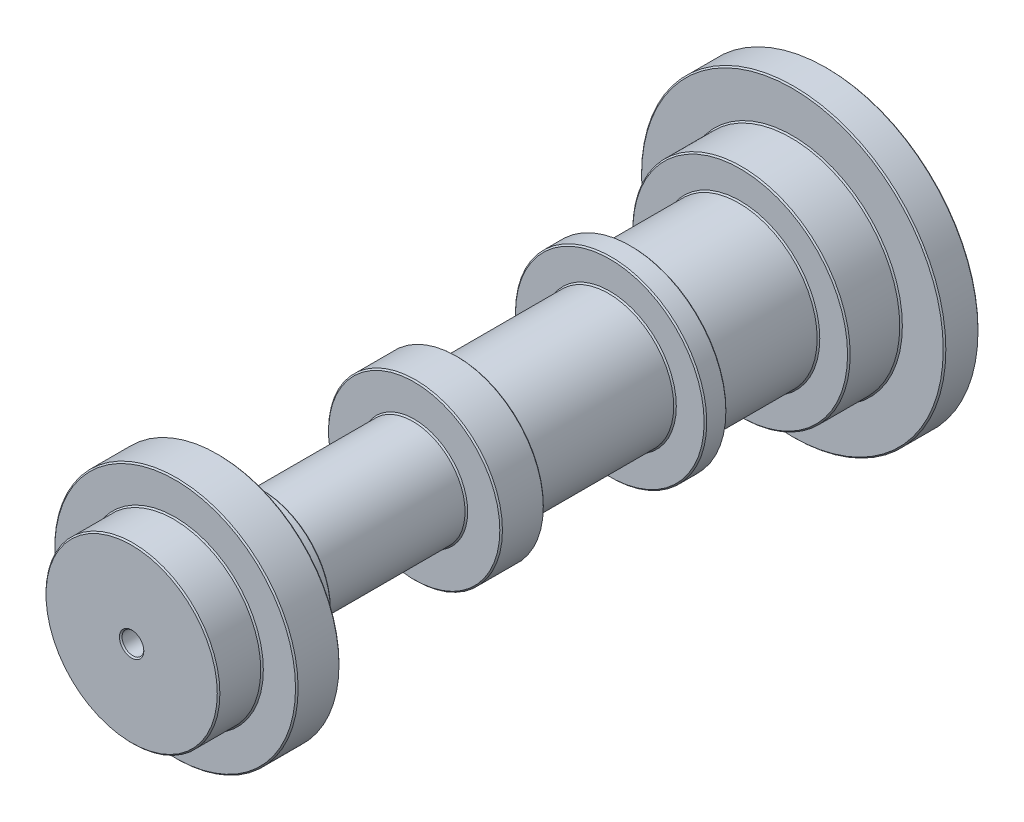
ISO-10303-21;
HEADER;
FILE_DESCRIPTION(('STEP AP214'),'2;1');
FILE_NAME('part.step','',(''),(''),'','','');
FILE_SCHEMA(('AUTOMOTIVE_DESIGN { 1 0 10303 214 1 1 1 1 }'));
ENDSEC;
DATA;
#1=APPLICATION_CONTEXT('core data for automotive mechanical design processes');
#2=APPLICATION_PROTOCOL_DEFINITION('international standard','automotive_design',2000,#1);
#3=PRODUCT_CONTEXT('',#1,'mechanical');
#4=PRODUCT('Part','Part','',(#3));
#5=PRODUCT_RELATED_PRODUCT_CATEGORY('part','',(#4));
#6=PRODUCT_DEFINITION_FORMATION('','',#4);
#7=PRODUCT_DEFINITION_CONTEXT('part definition',#1,'design');
#8=PRODUCT_DEFINITION('design','',#6,#7);
#9=PRODUCT_DEFINITION_SHAPE('','',#8);
#10=(LENGTH_UNIT() NAMED_UNIT(*) SI_UNIT(.MILLI.,.METRE.));
#11=(NAMED_UNIT(*) PLANE_ANGLE_UNIT() SI_UNIT($,.RADIAN.));
#12=(NAMED_UNIT(*) SI_UNIT($,.STERADIAN.) SOLID_ANGLE_UNIT());
#13=UNCERTAINTY_MEASURE_WITH_UNIT(LENGTH_MEASURE(1.E-05),#10,'distance_accuracy_value','');
#14=(GEOMETRIC_REPRESENTATION_CONTEXT(3) GLOBAL_UNCERTAINTY_ASSIGNED_CONTEXT((#13)) GLOBAL_UNIT_ASSIGNED_CONTEXT((#10,
#11,#12)) REPRESENTATION_CONTEXT('',''));
#15=CARTESIAN_POINT('',(0.,0.,0.));
#16=DIRECTION('',(0.,0.,1.));
#17=DIRECTION('',(1.,0.,0.));
#18=AXIS2_PLACEMENT_3D('',#15,#16,#17);
#19=CARTESIAN_POINT('',(0.,0.,85.));
#20=DIRECTION('',(0.,0.,1.));
#21=DIRECTION('',(1.,0.,0.));
#22=AXIS2_PLACEMENT_3D('',#19,#20,#21);
#23=CYLINDRICAL_SURFACE('',#22,20.);
#24=DIRECTION('',(0.,0.,1.));
#25=VECTOR('',#24,1.);
#26=CARTESIAN_POINT('',(20.,0.,85.));
#27=LINE('',#26,#25);
#28=CARTESIAN_POINT('',(20.,0.,85.3));
#29=VERTEX_POINT('',#28);
#30=CARTESIAN_POINT('',(20.,0.,94.7));
#31=VERTEX_POINT('',#30);
#32=EDGE_CURVE('E10',#29,#31,#27,.T.);
#33=ORIENTED_EDGE('',*,*,#32,.F.);
#34=CARTESIAN_POINT('',(0.,0.,85.3));
#35=DIRECTION('',(0.,0.,1.));
#36=DIRECTION('',(1.,0.,0.));
#37=AXIS2_PLACEMENT_3D('',#34,#35,#36);
#38=CIRCLE('',#37,20.);
#39=EDGE_CURVE('E448',#29,#29,#38,.T.);
#40=ORIENTED_EDGE('',*,*,#39,.T.);
#41=ORIENTED_EDGE('',*,*,#32,.T.);
#42=CARTESIAN_POINT('',(0.,0.,94.7));
#43=DIRECTION('',(0.,0.,1.));
#44=DIRECTION('',(1.,0.,0.));
#45=AXIS2_PLACEMENT_3D('',#42,#43,#44);
#46=CIRCLE('',#45,20.);
#47=EDGE_CURVE('E458',#31,#31,#46,.T.);
#48=ORIENTED_EDGE('',*,*,#47,.F.);
#49=EDGE_LOOP('',(#33,#40,#41,#48));
#50=FACE_BOUND('',#49,.T.);
#51=ADVANCED_FACE('F16',(#50),#23,.T.);
#52=CARTESIAN_POINT('',(0.,0.,94.7));
#53=DIRECTION('',(0.,0.,-1.));
#54=DIRECTION('',(1.,0.,0.));
#55=AXIS2_PLACEMENT_3D('',#52,#53,#54);
#56=CONICAL_SURFACE('',#55,20.,0.785398163397);
#57=ORIENTED_EDGE('',*,*,#47,.T.);
#58=DIRECTION('',(0.707106781186548,0.,-0.707106781186548));
#59=VECTOR('',#58,1.);
#60=CARTESIAN_POINT('',(20.,0.,94.7));
#61=LINE('',#60,#59);
#62=CARTESIAN_POINT('',(19.7,0.,95.));
#63=VERTEX_POINT('',#62);
#64=EDGE_CURVE('E20',#63,#31,#61,.T.);
#65=ORIENTED_EDGE('',*,*,#64,.F.);
#66=CARTESIAN_POINT('',(0.,0.,95.));
#67=DIRECTION('',(0.,0.,1.));
#68=DIRECTION('',(1.,0.,0.));
#69=AXIS2_PLACEMENT_3D('',#66,#67,#68);
#70=CIRCLE('',#69,19.7);
#71=EDGE_CURVE('E269',#63,#63,#70,.T.);
#72=ORIENTED_EDGE('',*,*,#71,.F.);
#73=ORIENTED_EDGE('',*,*,#64,.T.);
#74=EDGE_LOOP('',(#57,#65,#72,#73));
#75=FACE_BOUND('',#74,.T.);
#76=ADVANCED_FACE('F467',(#75),#56,.T.);
#77=CARTESIAN_POINT('',(0.,0.,85.3));
#78=DIRECTION('',(0.,0.,1.));
#79=DIRECTION('',(1.,0.,0.));
#80=AXIS2_PLACEMENT_3D('',#77,#78,#79);
#81=CONICAL_SURFACE('',#80,20.,0.785398163397);
#82=DIRECTION('',(0.707106781186548,0.,0.707106781186548));
#83=VECTOR('',#82,1.);
#84=CARTESIAN_POINT('',(20.,0.,85.3));
#85=LINE('',#84,#83);
#86=CARTESIAN_POINT('',(19.7,0.,85.));
#87=VERTEX_POINT('',#86);
#88=EDGE_CURVE('E273',#87,#29,#85,.T.);
#89=ORIENTED_EDGE('',*,*,#88,.F.);
#90=CARTESIAN_POINT('',(0.,0.,85.));
#91=DIRECTION('',(0.,0.,1.));
#92=DIRECTION('',(1.,0.,0.));
#93=AXIS2_PLACEMENT_3D('',#90,#91,#92);
#94=CIRCLE('',#93,19.7);
#95=EDGE_CURVE('E274',#87,#87,#94,.T.);
#96=ORIENTED_EDGE('',*,*,#95,.T.);
#97=ORIENTED_EDGE('',*,*,#88,.T.);
#98=ORIENTED_EDGE('',*,*,#39,.F.);
#99=EDGE_LOOP('',(#89,#96,#97,#98));
#100=FACE_BOUND('',#99,.T.);
#101=ADVANCED_FACE('F473',(#100),#81,.T.);
#102=CARTESIAN_POINT('',(0.,0.,95.));
#103=DIRECTION('',(0.,0.,1.));
#104=DIRECTION('',(1.,0.,0.));
#105=AXIS2_PLACEMENT_3D('',#102,#103,#104);
#106=PLANE('',#105);
#107=ORIENTED_EDGE('',*,*,#71,.T.);
#108=EDGE_LOOP('',(#107));
#109=FACE_BOUND('',#108,.T.);
#110=CARTESIAN_POINT('',(0.,0.,95.));
#111=DIRECTION('',(0.,0.,1.));
#112=DIRECTION('',(1.,0.,0.));
#113=AXIS2_PLACEMENT_3D('',#110,#111,#112);
#114=CIRCLE('',#113,12.3);
#115=CARTESIAN_POINT('',(12.3,0.,95.));
#116=VERTEX_POINT('',#115);
#117=EDGE_CURVE('E414',#116,#116,#114,.T.);
#118=ORIENTED_EDGE('',*,*,#117,.F.);
#119=EDGE_LOOP('',(#118));
#120=FACE_BOUND('',#119,.T.);
#121=ADVANCED_FACE('F469',(#109,#120),#106,.T.);
#122=CARTESIAN_POINT('',(0.,0.,85.));
#123=DIRECTION('',(0.,0.,1.));
#124=DIRECTION('',(1.,0.,0.));
#125=AXIS2_PLACEMENT_3D('',#122,#123,#124);
#126=PLANE('',#125);
#127=ORIENTED_EDGE('',*,*,#95,.F.);
#128=EDGE_LOOP('',(#127));
#129=FACE_BOUND('',#128,.T.);
#130=CARTESIAN_POINT('',(0.,0.,85.));
#131=DIRECTION('',(0.,0.,1.));
#132=DIRECTION('',(1.,0.,0.));
#133=AXIS2_PLACEMENT_3D('',#130,#131,#132);
#134=CIRCLE('',#133,15.3);
#135=CARTESIAN_POINT('',(15.3,0.,85.));
#136=VERTEX_POINT('',#135);
#137=EDGE_CURVE('E332',#136,#136,#134,.T.);
#138=ORIENTED_EDGE('',*,*,#137,.T.);
#139=EDGE_LOOP('',(#138));
#140=FACE_BOUND('',#139,.T.);
#141=ADVANCED_FACE('F472',(#129,#140),#126,.F.);
#142=CARTESIAN_POINT('',(0.,0.,95.3));
#143=DIRECTION('',(0.,0.,-1.));
#144=DIRECTION('',(1.,0.,0.));
#145=AXIS2_PLACEMENT_3D('',#142,#143,#144);
#146=CONICAL_SURFACE('',#145,12.,0.785398163397);
#147=ORIENTED_EDGE('',*,*,#117,.T.);
#148=DIRECTION('',(0.707106781186548,0.,-0.707106781186548));
#149=VECTOR('',#148,1.);
#150=CARTESIAN_POINT('',(12.,0.,95.3));
#151=LINE('',#150,#149);
#152=CARTESIAN_POINT('',(12.,0.,95.3));
#153=VERTEX_POINT('',#152);
#154=EDGE_CURVE('E418',#153,#116,#151,.T.);
#155=ORIENTED_EDGE('',*,*,#154,.F.);
#156=CARTESIAN_POINT('',(0.,0.,95.3));
#157=DIRECTION('',(0.,0.,1.));
#158=DIRECTION('',(1.,0.,0.));
#159=AXIS2_PLACEMENT_3D('',#156,#157,#158);
#160=CIRCLE('',#159,12.);
#161=EDGE_CURVE('E287',#153,#153,#160,.T.);
#162=ORIENTED_EDGE('',*,*,#161,.F.);
#163=ORIENTED_EDGE('',*,*,#154,.T.);
#164=EDGE_LOOP('',(#147,#155,#162,#163));
#165=FACE_BOUND('',#164,.T.);
#166=ADVANCED_FACE('F18',(#165),#146,.T.);
#167=CARTESIAN_POINT('',(0.,0.,84.7));
#168=DIRECTION('',(0.,0.,1.));
#169=DIRECTION('',(1.,0.,0.));
#170=AXIS2_PLACEMENT_3D('',#167,#168,#169);
#171=CONICAL_SURFACE('',#170,15.,0.785398163397);
#172=DIRECTION('',(0.707106781186548,0.,0.707106781186548));
#173=VECTOR('',#172,1.);
#174=CARTESIAN_POINT('',(15.,0.,84.7));
#175=LINE('',#174,#173);
#176=CARTESIAN_POINT('',(15.,0.,84.7));
#177=VERTEX_POINT('',#176);
#178=EDGE_CURVE('E328',#177,#136,#175,.T.);
#179=ORIENTED_EDGE('',*,*,#178,.F.);
#180=CARTESIAN_POINT('',(0.,0.,84.7));
#181=DIRECTION('',(0.,0.,1.));
#182=DIRECTION('',(1.,0.,0.));
#183=AXIS2_PLACEMENT_3D('',#180,#181,#182);
#184=CIRCLE('',#183,15.);
#185=EDGE_CURVE('E288',#177,#177,#184,.T.);
#186=ORIENTED_EDGE('',*,*,#185,.T.);
#187=ORIENTED_EDGE('',*,*,#178,.T.);
#188=ORIENTED_EDGE('',*,*,#137,.F.);
#189=EDGE_LOOP('',(#179,#186,#187,#188));
#190=FACE_BOUND('',#189,.T.);
#191=ADVANCED_FACE('F608',(#190),#171,.T.);
#192=CARTESIAN_POINT('',(0.,0.,95.));
#193=DIRECTION('',(0.,0.,1.));
#194=DIRECTION('',(1.,0.,0.));
#195=AXIS2_PLACEMENT_3D('',#192,#193,#194);
#196=CYLINDRICAL_SURFACE('',#195,12.);
#197=DIRECTION('',(0.,0.,1.));
#198=VECTOR('',#197,1.);
#199=CARTESIAN_POINT('',(12.,0.,95.));
#200=LINE('',#199,#198);
#201=CARTESIAN_POINT('',(12.,0.,129.7));
#202=VERTEX_POINT('',#201);
#203=EDGE_CURVE('E284',#153,#202,#200,.T.);
#204=ORIENTED_EDGE('',*,*,#203,.F.);
#205=ORIENTED_EDGE('',*,*,#161,.T.);
#206=ORIENTED_EDGE('',*,*,#203,.T.);
#207=CARTESIAN_POINT('',(0.,0.,129.7));
#208=DIRECTION('',(0.,0.,1.));
#209=DIRECTION('',(1.,0.,0.));
#210=AXIS2_PLACEMENT_3D('',#207,#208,#209);
#211=CIRCLE('',#210,12.);
#212=EDGE_CURVE('E405',#202,#202,#211,.T.);
#213=ORIENTED_EDGE('',*,*,#212,.F.);
#214=EDGE_LOOP('',(#204,#205,#206,#213));
#215=FACE_BOUND('',#214,.T.);
#216=ADVANCED_FACE('F481',(#215),#196,.T.);
#217=CARTESIAN_POINT('',(0.,0.,50.));
#218=DIRECTION('',(0.,0.,1.));
#219=DIRECTION('',(1.,0.,0.));
#220=AXIS2_PLACEMENT_3D('',#217,#218,#219);
#221=CYLINDRICAL_SURFACE('',#220,15.);
#222=DIRECTION('',(0.,0.,1.));
#223=VECTOR('',#222,1.);
#224=CARTESIAN_POINT('',(15.,0.,50.));
#225=LINE('',#224,#223);
#226=CARTESIAN_POINT('',(15.,0.,50.3));
#227=VERTEX_POINT('',#226);
#228=EDGE_CURVE('E438',#227,#177,#225,.T.);
#229=ORIENTED_EDGE('',*,*,#228,.F.);
#230=CARTESIAN_POINT('',(0.,0.,50.3));
#231=DIRECTION('',(0.,0.,1.));
#232=DIRECTION('',(1.,0.,0.));
#233=AXIS2_PLACEMENT_3D('',#230,#231,#232);
#234=CIRCLE('',#233,15.);
#235=EDGE_CURVE('E248',#227,#227,#234,.T.);
#236=ORIENTED_EDGE('',*,*,#235,.T.);
#237=ORIENTED_EDGE('',*,*,#228,.T.);
#238=ORIENTED_EDGE('',*,*,#185,.F.);
#239=EDGE_LOOP('',(#229,#236,#237,#238));
#240=FACE_BOUND('',#239,.T.);
#241=ADVANCED_FACE('F614',(#240),#221,.T.);
#242=CARTESIAN_POINT('',(0.,0.,129.7));
#243=DIRECTION('',(0.,0.,1.));
#244=DIRECTION('',(1.,0.,0.));
#245=AXIS2_PLACEMENT_3D('',#242,#243,#244);
#246=CONICAL_SURFACE('',#245,12.,0.785398163397);
#247=ORIENTED_EDGE('',*,*,#212,.T.);
#248=DIRECTION('',(-0.707106781186548,0.,-0.707106781186548));
#249=VECTOR('',#248,1.);
#250=CARTESIAN_POINT('',(12.,0.,129.7));
#251=LINE('',#250,#249);
#252=CARTESIAN_POINT('',(12.3,0.,130.));
#253=VERTEX_POINT('',#252);
#254=EDGE_CURVE('E409',#253,#202,#251,.T.);
#255=ORIENTED_EDGE('',*,*,#254,.F.);
#256=CARTESIAN_POINT('',(0.,0.,130.));
#257=DIRECTION('',(0.,0.,1.));
#258=DIRECTION('',(1.,0.,0.));
#259=AXIS2_PLACEMENT_3D('',#256,#257,#258);
#260=CIRCLE('',#259,12.3);
#261=EDGE_CURVE('E249',#253,#253,#260,.T.);
#262=ORIENTED_EDGE('',*,*,#261,.F.);
#263=ORIENTED_EDGE('',*,*,#254,.T.);
#264=EDGE_LOOP('',(#247,#255,#262,#263));
#265=FACE_BOUND('',#264,.T.);
#266=ADVANCED_FACE('F484',(#265),#246,.T.);
#267=CARTESIAN_POINT('',(0.,0.,50.3));
#268=DIRECTION('',(0.,0.,-1.));
#269=DIRECTION('',(1.,0.,0.));
#270=AXIS2_PLACEMENT_3D('',#267,#268,#269);
#271=CONICAL_SURFACE('',#270,15.,0.785398163397);
#272=DIRECTION('',(-0.707106781186548,0.,0.707106781186548));
#273=VECTOR('',#272,1.);
#274=CARTESIAN_POINT('',(15.,0.,50.3));
#275=LINE('',#274,#273);
#276=CARTESIAN_POINT('',(15.3,0.,50.));
#277=VERTEX_POINT('',#276);
#278=EDGE_CURVE('E244',#277,#227,#275,.T.);
#279=ORIENTED_EDGE('',*,*,#278,.F.);
#280=CARTESIAN_POINT('',(0.,0.,50.));
#281=DIRECTION('',(0.,0.,1.));
#282=DIRECTION('',(1.,0.,0.));
#283=AXIS2_PLACEMENT_3D('',#280,#281,#282);
#284=CIRCLE('',#283,15.3);
#285=EDGE_CURVE('E428',#277,#277,#284,.T.);
#286=ORIENTED_EDGE('',*,*,#285,.T.);
#287=ORIENTED_EDGE('',*,*,#278,.T.);
#288=ORIENTED_EDGE('',*,*,#235,.F.);
#289=EDGE_LOOP('',(#279,#286,#287,#288));
#290=FACE_BOUND('',#289,.T.);
#291=ADVANCED_FACE('F490',(#290),#271,.T.);
#292=CARTESIAN_POINT('',(0.,0.,130.));
#293=DIRECTION('',(0.,0.,1.));
#294=DIRECTION('',(1.,0.,0.));
#295=AXIS2_PLACEMENT_3D('',#292,#293,#294);
#296=PLANE('',#295);
#297=ORIENTED_EDGE('',*,*,#261,.T.);
#298=EDGE_LOOP('',(#297));
#299=FACE_BOUND('',#298,.T.);
#300=CARTESIAN_POINT('',(0.,0.,130.));
#301=DIRECTION('',(0.,0.,1.));
#302=DIRECTION('',(1.,0.,0.));
#303=AXIS2_PLACEMENT_3D('',#300,#301,#302);
#304=CIRCLE('',#303,15.7);
#305=CARTESIAN_POINT('',(15.7,0.,130.));
#306=VERTEX_POINT('',#305);
#307=EDGE_CURVE('E419',#306,#306,#304,.T.);
#308=ORIENTED_EDGE('',*,*,#307,.F.);
#309=EDGE_LOOP('',(#308));
#310=FACE_BOUND('',#309,.T.);
#311=ADVANCED_FACE('F486',(#299,#310),#296,.F.);
#312=CARTESIAN_POINT('',(0.,0.,50.));
#313=DIRECTION('',(0.,0.,1.));
#314=DIRECTION('',(1.,0.,0.));
#315=AXIS2_PLACEMENT_3D('',#312,#313,#314);
#316=PLANE('',#315);
#317=ORIENTED_EDGE('',*,*,#285,.F.);
#318=EDGE_LOOP('',(#317));
#319=FACE_BOUND('',#318,.T.);
#320=CARTESIAN_POINT('',(0.,0.,50.));
#321=DIRECTION('',(0.,0.,1.));
#322=DIRECTION('',(1.,0.,0.));
#323=AXIS2_PLACEMENT_3D('',#320,#321,#322);
#324=CIRCLE('',#323,21.7);
#325=CARTESIAN_POINT('',(21.7,0.,50.));
#326=VERTEX_POINT('',#325);
#327=EDGE_CURVE('E413',#326,#326,#324,.T.);
#328=ORIENTED_EDGE('',*,*,#327,.T.);
#329=EDGE_LOOP('',(#328));
#330=FACE_BOUND('',#329,.T.);
#331=ADVANCED_FACE('F489',(#319,#330),#316,.T.);
#332=CARTESIAN_POINT('',(0.,0.,130.3));
#333=DIRECTION('',(0.,0.,1.));
#334=DIRECTION('',(1.,0.,0.));
#335=AXIS2_PLACEMENT_3D('',#332,#333,#334);
#336=CONICAL_SURFACE('',#335,16.,0.785398163397);
#337=ORIENTED_EDGE('',*,*,#307,.T.);
#338=DIRECTION('',(-0.707106781186548,0.,-0.707106781186548));
#339=VECTOR('',#338,1.);
#340=CARTESIAN_POINT('',(16.,0.,130.3));
#341=LINE('',#340,#339);
#342=CARTESIAN_POINT('',(16.,0.,130.3));
#343=VERTEX_POINT('',#342);
#344=EDGE_CURVE('E423',#343,#306,#341,.T.);
#345=ORIENTED_EDGE('',*,*,#344,.F.);
#346=CARTESIAN_POINT('',(0.,0.,130.3));
#347=DIRECTION('',(0.,0.,1.));
#348=DIRECTION('',(1.,0.,0.));
#349=AXIS2_PLACEMENT_3D('',#346,#347,#348);
#350=CIRCLE('',#349,16.);
#351=EDGE_CURVE('E323',#343,#343,#350,.T.);
#352=ORIENTED_EDGE('',*,*,#351,.F.);
#353=ORIENTED_EDGE('',*,*,#344,.T.);
#354=EDGE_LOOP('',(#337,#345,#352,#353));
#355=FACE_BOUND('',#354,.T.);
#356=ADVANCED_FACE('F494',(#355),#336,.T.);
#357=CARTESIAN_POINT('',(0.,0.,49.7));
#358=DIRECTION('',(0.,0.,-1.));
#359=DIRECTION('',(1.,0.,0.));
#360=AXIS2_PLACEMENT_3D('',#357,#358,#359);
#361=CONICAL_SURFACE('',#360,22.,0.785398163397);
#362=DIRECTION('',(-0.707106781186548,0.,0.707106781186548));
#363=VECTOR('',#362,1.);
#364=CARTESIAN_POINT('',(22.,0.,49.7));
#365=LINE('',#364,#363);
#366=CARTESIAN_POINT('',(22.,0.,49.7));
#367=VERTEX_POINT('',#366);
#368=EDGE_CURVE('E404',#367,#326,#365,.T.);
#369=ORIENTED_EDGE('',*,*,#368,.F.);
#370=CARTESIAN_POINT('',(0.,0.,49.7));
#371=DIRECTION('',(0.,0.,1.));
#372=DIRECTION('',(1.,0.,0.));
#373=AXIS2_PLACEMENT_3D('',#370,#371,#372);
#374=CIRCLE('',#373,22.);
#375=EDGE_CURVE('E324',#367,#367,#374,.T.);
#376=ORIENTED_EDGE('',*,*,#375,.T.);
#377=ORIENTED_EDGE('',*,*,#368,.T.);
#378=ORIENTED_EDGE('',*,*,#327,.F.);
#379=EDGE_LOOP('',(#369,#376,#377,#378));
#380=FACE_BOUND('',#379,.T.);
#381=ADVANCED_FACE('F623',(#380),#361,.T.);
#382=CARTESIAN_POINT('',(0.,0.,130.));
#383=DIRECTION('',(0.,0.,1.));
#384=DIRECTION('',(1.,0.,0.));
#385=AXIS2_PLACEMENT_3D('',#382,#383,#384);
#386=CYLINDRICAL_SURFACE('',#385,16.);
#387=DIRECTION('',(0.,0.,1.));
#388=VECTOR('',#387,1.);
#389=CARTESIAN_POINT('',(16.,0.,130.));
#390=LINE('',#389,#388);
#391=CARTESIAN_POINT('',(16.,0.,139.7));
#392=VERTEX_POINT('',#391);
#393=EDGE_CURVE('E320',#343,#392,#390,.T.);
#394=ORIENTED_EDGE('',*,*,#393,.F.);
#395=ORIENTED_EDGE('',*,*,#351,.T.);
#396=ORIENTED_EDGE('',*,*,#393,.T.);
#397=CARTESIAN_POINT('',(0.,0.,139.7));
#398=DIRECTION('',(0.,0.,1.));
#399=DIRECTION('',(1.,0.,0.));
#400=AXIS2_PLACEMENT_3D('',#397,#398,#399);
#401=CIRCLE('',#400,16.);
#402=EDGE_CURVE('E389',#392,#392,#401,.T.);
#403=ORIENTED_EDGE('',*,*,#402,.F.);
#404=EDGE_LOOP('',(#394,#395,#396,#403));
#405=FACE_BOUND('',#404,.T.);
#406=ADVANCED_FACE('F499',(#405),#386,.T.);
#407=CARTESIAN_POINT('',(0.,0.,45.));
#408=DIRECTION('',(0.,0.,1.));
#409=DIRECTION('',(1.,0.,0.));
#410=AXIS2_PLACEMENT_3D('',#407,#408,#409);
#411=CYLINDRICAL_SURFACE('',#410,22.);
#412=DIRECTION('',(0.,0.,1.));
#413=VECTOR('',#412,1.);
#414=CARTESIAN_POINT('',(22.,0.,45.));
#415=LINE('',#414,#413);
#416=CARTESIAN_POINT('',(22.,0.,45.3));
#417=VERTEX_POINT('',#416);
#418=EDGE_CURVE('E394',#417,#367,#415,.T.);
#419=ORIENTED_EDGE('',*,*,#418,.F.);
#420=CARTESIAN_POINT('',(0.,0.,45.3));
#421=DIRECTION('',(0.,0.,1.));
#422=DIRECTION('',(1.,0.,0.));
#423=AXIS2_PLACEMENT_3D('',#420,#421,#422);
#424=CIRCLE('',#423,22.);
#425=EDGE_CURVE('E305',#417,#417,#424,.T.);
#426=ORIENTED_EDGE('',*,*,#425,.T.);
#427=ORIENTED_EDGE('',*,*,#418,.T.);
#428=ORIENTED_EDGE('',*,*,#375,.F.);
#429=EDGE_LOOP('',(#419,#426,#427,#428));
#430=FACE_BOUND('',#429,.T.);
#431=ADVANCED_FACE('F629',(#430),#411,.T.);
#432=CARTESIAN_POINT('',(0.,0.,139.7));
#433=DIRECTION('',(0.,0.,1.));
#434=DIRECTION('',(1.,0.,0.));
#435=AXIS2_PLACEMENT_3D('',#432,#433,#434);
#436=CONICAL_SURFACE('',#435,16.,0.785398163397);
#437=ORIENTED_EDGE('',*,*,#402,.T.);
#438=DIRECTION('',(-0.707106781186548,0.,-0.707106781186548));
#439=VECTOR('',#438,1.);
#440=CARTESIAN_POINT('',(16.,0.,139.7));
#441=LINE('',#440,#439);
#442=CARTESIAN_POINT('',(16.3,0.,140.));
#443=VERTEX_POINT('',#442);
#444=EDGE_CURVE('E390',#443,#392,#441,.T.);
#445=ORIENTED_EDGE('',*,*,#444,.F.);
#446=CARTESIAN_POINT('',(0.,0.,140.));
#447=DIRECTION('',(0.,0.,1.));
#448=DIRECTION('',(1.,0.,0.));
#449=AXIS2_PLACEMENT_3D('',#446,#447,#448);
#450=CIRCLE('',#449,16.3);
#451=EDGE_CURVE('E306',#443,#443,#450,.T.);
#452=ORIENTED_EDGE('',*,*,#451,.F.);
#453=ORIENTED_EDGE('',*,*,#444,.T.);
#454=EDGE_LOOP('',(#437,#445,#452,#453));
#455=FACE_BOUND('',#454,.T.);
#456=ADVANCED_FACE('F503',(#455),#436,.T.);
#457=CARTESIAN_POINT('',(0.,0.,45.3));
#458=DIRECTION('',(0.,0.,1.));
#459=DIRECTION('',(1.,0.,0.));
#460=AXIS2_PLACEMENT_3D('',#457,#458,#459);
#461=CONICAL_SURFACE('',#460,22.,0.785398163397);
#462=DIRECTION('',(0.707106781186548,0.,0.707106781186548));
#463=VECTOR('',#462,1.);
#464=CARTESIAN_POINT('',(22.,0.,45.3));
#465=LINE('',#464,#463);
#466=CARTESIAN_POINT('',(21.7,0.,45.));
#467=VERTEX_POINT('',#466);
#468=EDGE_CURVE('E301',#467,#417,#465,.T.);
#469=ORIENTED_EDGE('',*,*,#468,.F.);
#470=CARTESIAN_POINT('',(0.,0.,45.));
#471=DIRECTION('',(0.,0.,1.));
#472=DIRECTION('',(1.,0.,0.));
#473=AXIS2_PLACEMENT_3D('',#470,#471,#472);
#474=CIRCLE('',#473,21.7);
#475=EDGE_CURVE('E379',#467,#467,#474,.T.);
#476=ORIENTED_EDGE('',*,*,#475,.T.);
#477=ORIENTED_EDGE('',*,*,#468,.T.);
#478=ORIENTED_EDGE('',*,*,#425,.F.);
#479=EDGE_LOOP('',(#469,#476,#477,#478));
#480=FACE_BOUND('',#479,.T.);
#481=ADVANCED_FACE('F509',(#480),#461,.T.);
#482=CARTESIAN_POINT('',(0.,0.,140.));
#483=DIRECTION('',(0.,0.,1.));
#484=DIRECTION('',(1.,0.,0.));
#485=AXIS2_PLACEMENT_3D('',#482,#483,#484);
#486=PLANE('',#485);
#487=ORIENTED_EDGE('',*,*,#451,.T.);
#488=EDGE_LOOP('',(#487));
#489=FACE_BOUND('',#488,.T.);
#490=CARTESIAN_POINT('',(0.,0.,140.));
#491=DIRECTION('',(0.,0.,1.));
#492=DIRECTION('',(1.,0.,0.));
#493=AXIS2_PLACEMENT_3D('',#490,#491,#492);
#494=CIRCLE('',#493,27.7);
#495=CARTESIAN_POINT('',(27.7,0.,140.));
#496=VERTEX_POINT('',#495);
#497=EDGE_CURVE('E372',#496,#496,#494,.T.);
#498=ORIENTED_EDGE('',*,*,#497,.F.);
#499=EDGE_LOOP('',(#498));
#500=FACE_BOUND('',#499,.T.);
#501=ADVANCED_FACE('F505',(#489,#500),#486,.F.);
#502=CARTESIAN_POINT('',(0.,0.,45.));
#503=DIRECTION('',(0.,0.,1.));
#504=DIRECTION('',(1.,0.,0.));
#505=AXIS2_PLACEMENT_3D('',#502,#503,#504);
#506=PLANE('',#505);
#507=ORIENTED_EDGE('',*,*,#475,.F.);
#508=EDGE_LOOP('',(#507));
#509=FACE_BOUND('',#508,.T.);
#510=CARTESIAN_POINT('',(0.,0.,45.));
#511=DIRECTION('',(0.,0.,1.));
#512=DIRECTION('',(1.,0.,0.));
#513=AXIS2_PLACEMENT_3D('',#510,#511,#512);
#514=CIRCLE('',#513,18.3);
#515=CARTESIAN_POINT('',(18.3,0.,45.));
#516=VERTEX_POINT('',#515);
#517=EDGE_CURVE('E368',#516,#516,#514,.T.);
#518=ORIENTED_EDGE('',*,*,#517,.T.);
#519=EDGE_LOOP('',(#518));
#520=FACE_BOUND('',#519,.T.);
#521=ADVANCED_FACE('F508',(#509,#520),#506,.F.);
#522=CARTESIAN_POINT('',(0.,0.,140.3));
#523=DIRECTION('',(0.,0.,1.));
#524=DIRECTION('',(1.,0.,0.));
#525=AXIS2_PLACEMENT_3D('',#522,#523,#524);
#526=CONICAL_SURFACE('',#525,28.,0.785398163397);
#527=ORIENTED_EDGE('',*,*,#497,.T.);
#528=DIRECTION('',(-0.707106781186548,0.,-0.707106781186548));
#529=VECTOR('',#528,1.);
#530=CARTESIAN_POINT('',(28.,0.,140.3));
#531=LINE('',#530,#529);
#532=CARTESIAN_POINT('',(28.,0.,140.3));
#533=VERTEX_POINT('',#532);
#534=EDGE_CURVE('E376',#533,#496,#531,.T.);
#535=ORIENTED_EDGE('',*,*,#534,.F.);
#536=CARTESIAN_POINT('',(0.,0.,140.3));
#537=DIRECTION('',(0.,0.,1.));
#538=DIRECTION('',(1.,0.,0.));
#539=AXIS2_PLACEMENT_3D('',#536,#537,#538);
#540=CIRCLE('',#539,28.);
#541=EDGE_CURVE('E278',#533,#533,#540,.T.);
#542=ORIENTED_EDGE('',*,*,#541,.F.);
#543=ORIENTED_EDGE('',*,*,#534,.T.);
#544=EDGE_LOOP('',(#527,#535,#542,#543));
#545=FACE_BOUND('',#544,.T.);
#546=ADVANCED_FACE('F513',(#545),#526,.T.);
#547=CARTESIAN_POINT('',(0.,0.,44.7));
#548=DIRECTION('',(0.,0.,1.));
#549=DIRECTION('',(1.,0.,0.));
#550=AXIS2_PLACEMENT_3D('',#547,#548,#549);
#551=CONICAL_SURFACE('',#550,18.,0.785398163397);
#552=DIRECTION('',(0.707106781186548,0.,0.707106781186548));
#553=VECTOR('',#552,1.);
#554=CARTESIAN_POINT('',(18.,0.,44.7));
#555=LINE('',#554,#553);
#556=CARTESIAN_POINT('',(18.,0.,44.7));
#557=VERTEX_POINT('',#556);
#558=EDGE_CURVE('E364',#557,#516,#555,.T.);
#559=ORIENTED_EDGE('',*,*,#558,.F.);
#560=CARTESIAN_POINT('',(0.,0.,44.7));
#561=DIRECTION('',(0.,0.,1.));
#562=DIRECTION('',(1.,0.,0.));
#563=AXIS2_PLACEMENT_3D('',#560,#561,#562);
#564=CIRCLE('',#563,18.);
#565=EDGE_CURVE('E279',#557,#557,#564,.T.);
#566=ORIENTED_EDGE('',*,*,#565,.T.);
#567=ORIENTED_EDGE('',*,*,#558,.T.);
#568=ORIENTED_EDGE('',*,*,#517,.F.);
#569=EDGE_LOOP('',(#559,#566,#567,#568));
#570=FACE_BOUND('',#569,.T.);
#571=ADVANCED_FACE('F644',(#570),#551,.T.);
#572=CARTESIAN_POINT('',(0.,0.,140.));
#573=DIRECTION('',(0.,0.,1.));
#574=DIRECTION('',(1.,0.,0.));
#575=AXIS2_PLACEMENT_3D('',#572,#573,#574);
#576=CYLINDRICAL_SURFACE('',#575,28.);
#577=DIRECTION('',(0.,0.,1.));
#578=VECTOR('',#577,1.);
#579=CARTESIAN_POINT('',(28.,0.,140.));
#580=LINE('',#579,#578);
#581=CARTESIAN_POINT('',(28.,0.,149.7));
#582=VERTEX_POINT('',#581);
#583=EDGE_CURVE('E275',#533,#582,#580,.T.);
#584=ORIENTED_EDGE('',*,*,#583,.F.);
#585=ORIENTED_EDGE('',*,*,#541,.T.);
#586=ORIENTED_EDGE('',*,*,#583,.T.);
#587=CARTESIAN_POINT('',(0.,0.,149.7));
#588=DIRECTION('',(0.,0.,1.));
#589=DIRECTION('',(1.,0.,0.));
#590=AXIS2_PLACEMENT_3D('',#587,#588,#589);
#591=CIRCLE('',#590,28.);
#592=EDGE_CURVE('E349',#582,#582,#591,.T.);
#593=ORIENTED_EDGE('',*,*,#592,.F.);
#594=EDGE_LOOP('',(#584,#585,#586,#593));
#595=FACE_BOUND('',#594,.T.);
#596=ADVANCED_FACE('F518',(#595),#576,.T.);
#597=CARTESIAN_POINT('',(0.,0.,20.));
#598=DIRECTION('',(0.,0.,1.));
#599=DIRECTION('',(1.,0.,0.));
#600=AXIS2_PLACEMENT_3D('',#597,#598,#599);
#601=CYLINDRICAL_SURFACE('',#600,18.);
#602=DIRECTION('',(0.,0.,1.));
#603=VECTOR('',#602,1.);
#604=CARTESIAN_POINT('',(18.,0.,20.));
#605=LINE('',#604,#603);
#606=CARTESIAN_POINT('',(18.,0.,20.3));
#607=VERTEX_POINT('',#606);
#608=EDGE_CURVE('E353',#607,#557,#605,.T.);
#609=ORIENTED_EDGE('',*,*,#608,.F.);
#610=CARTESIAN_POINT('',(0.,0.,20.3));
#611=DIRECTION('',(0.,0.,1.));
#612=DIRECTION('',(1.,0.,0.));
#613=AXIS2_PLACEMENT_3D('',#610,#611,#612);
#614=CIRCLE('',#613,18.);
#615=EDGE_CURVE('E345',#607,#607,#614,.T.);
#616=ORIENTED_EDGE('',*,*,#615,.T.);
#617=ORIENTED_EDGE('',*,*,#608,.T.);
#618=ORIENTED_EDGE('',*,*,#565,.F.);
#619=EDGE_LOOP('',(#609,#616,#617,#618));
#620=FACE_BOUND('',#619,.T.);
#621=ADVANCED_FACE('F643',(#620),#601,.T.);
#622=CARTESIAN_POINT('',(0.,0.,149.7));
#623=DIRECTION('',(0.,0.,-1.));
#624=DIRECTION('',(1.,0.,0.));
#625=AXIS2_PLACEMENT_3D('',#622,#623,#624);
#626=CONICAL_SURFACE('',#625,28.,0.785398163397);
#627=ORIENTED_EDGE('',*,*,#592,.T.);
#628=DIRECTION('',(0.707106781186548,0.,-0.707106781186548));
#629=VECTOR('',#628,1.);
#630=CARTESIAN_POINT('',(28.,0.,149.7));
#631=LINE('',#630,#629);
#632=CARTESIAN_POINT('',(27.7,0.,150.));
#633=VERTEX_POINT('',#632);
#634=EDGE_CURVE('E357',#633,#582,#631,.T.);
#635=ORIENTED_EDGE('',*,*,#634,.F.);
#636=CARTESIAN_POINT('',(0.,0.,150.));
#637=DIRECTION('',(0.,0.,1.));
#638=DIRECTION('',(1.,0.,0.));
#639=AXIS2_PLACEMENT_3D('',#636,#637,#638);
#640=CIRCLE('',#639,27.7);
#641=EDGE_CURVE('E337',#633,#633,#640,.T.);
#642=ORIENTED_EDGE('',*,*,#641,.F.);
#643=ORIENTED_EDGE('',*,*,#634,.T.);
#644=EDGE_LOOP('',(#627,#635,#642,#643));
#645=FACE_BOUND('',#644,.T.);
#646=ADVANCED_FACE('F521',(#645),#626,.T.);
#647=CARTESIAN_POINT('',(0.,0.,20.3));
#648=DIRECTION('',(0.,0.,-1.));
#649=DIRECTION('',(1.,0.,0.));
#650=AXIS2_PLACEMENT_3D('',#647,#648,#649);
#651=CONICAL_SURFACE('',#650,18.,0.785398163397);
#652=DIRECTION('',(-0.707106781186548,0.,0.707106781186548));
#653=VECTOR('',#652,1.);
#654=CARTESIAN_POINT('',(18.,0.,20.3));
#655=LINE('',#654,#653);
#656=CARTESIAN_POINT('',(18.3,0.,20.));
#657=VERTEX_POINT('',#656);
#658=EDGE_CURVE('E341',#657,#607,#655,.T.);
#659=ORIENTED_EDGE('',*,*,#658,.F.);
#660=CARTESIAN_POINT('',(0.,0.,20.));
#661=DIRECTION('',(0.,0.,1.));
#662=DIRECTION('',(1.,0.,0.));
#663=AXIS2_PLACEMENT_3D('',#660,#661,#662);
#664=CIRCLE('',#663,18.3);
#665=EDGE_CURVE('E333',#657,#657,#664,.T.);
#666=ORIENTED_EDGE('',*,*,#665,.T.);
#667=ORIENTED_EDGE('',*,*,#658,.T.);
#668=ORIENTED_EDGE('',*,*,#615,.F.);
#669=EDGE_LOOP('',(#659,#666,#667,#668));
#670=FACE_BOUND('',#669,.T.);
#671=ADVANCED_FACE('F527',(#670),#651,.T.);
#672=CARTESIAN_POINT('',(0.,0.,150.));
#673=DIRECTION('',(0.,0.,1.));
#674=DIRECTION('',(1.,0.,0.));
#675=AXIS2_PLACEMENT_3D('',#672,#673,#674);
#676=PLANE('',#675);
#677=ORIENTED_EDGE('',*,*,#641,.T.);
#678=EDGE_LOOP('',(#677));
#679=FACE_BOUND('',#678,.T.);
#680=CARTESIAN_POINT('',(0.,0.,150.));
#681=DIRECTION('',(0.,0.,1.));
#682=DIRECTION('',(1.,0.,0.));
#683=AXIS2_PLACEMENT_3D('',#680,#681,#682);
#684=CIRCLE('',#683,20.3);
#685=CARTESIAN_POINT('',(20.3,0.,150.));
#686=VERTEX_POINT('',#685);
#687=EDGE_CURVE('E256',#686,#686,#684,.T.);
#688=ORIENTED_EDGE('',*,*,#687,.F.);
#689=EDGE_LOOP('',(#688));
#690=FACE_BOUND('',#689,.T.);
#691=ADVANCED_FACE('F523',(#679,#690),#676,.T.);
#692=CARTESIAN_POINT('',(0.,0.,20.));
#693=DIRECTION('',(0.,0.,1.));
#694=DIRECTION('',(1.,0.,0.));
#695=AXIS2_PLACEMENT_3D('',#692,#693,#694);
#696=PLANE('',#695);
#697=ORIENTED_EDGE('',*,*,#665,.F.);
#698=EDGE_LOOP('',(#697));
#699=FACE_BOUND('',#698,.T.);
#700=CARTESIAN_POINT('',(0.,0.,20.));
#701=DIRECTION('',(0.,0.,1.));
#702=DIRECTION('',(1.,0.,0.));
#703=AXIS2_PLACEMENT_3D('',#700,#701,#702);
#704=CIRCLE('',#703,24.7);
#705=CARTESIAN_POINT('',(24.7,0.,20.));
#706=VERTEX_POINT('',#705);
#707=EDGE_CURVE('E253',#706,#706,#704,.T.);
#708=ORIENTED_EDGE('',*,*,#707,.T.);
#709=EDGE_LOOP('',(#708));
#710=FACE_BOUND('',#709,.T.);
#711=ADVANCED_FACE('F526',(#699,#710),#696,.T.);
#712=CARTESIAN_POINT('',(0.,0.,150.3));
#713=DIRECTION('',(0.,0.,-1.));
#714=DIRECTION('',(1.,0.,0.));
#715=AXIS2_PLACEMENT_3D('',#712,#713,#714);
#716=CONICAL_SURFACE('',#715,20.,0.785398163397);
#717=ORIENTED_EDGE('',*,*,#687,.T.);
#718=DIRECTION('',(0.707106781186548,0.,-0.707106781186548));
#719=VECTOR('',#718,1.);
#720=CARTESIAN_POINT('',(20.,0.,150.3));
#721=LINE('',#720,#719);
#722=CARTESIAN_POINT('',(20.,0.,150.3));
#723=VERTEX_POINT('',#722);
#724=EDGE_CURVE('E234',#723,#686,#721,.T.);
#725=ORIENTED_EDGE('',*,*,#724,.F.);
#726=CARTESIAN_POINT('',(0.,0.,150.3));
#727=DIRECTION('',(0.,0.,1.));
#728=DIRECTION('',(1.,0.,0.));
#729=AXIS2_PLACEMENT_3D('',#726,#727,#728);
#730=CIRCLE('',#729,20.);
#731=EDGE_CURVE('E313',#723,#723,#730,.T.);
#732=ORIENTED_EDGE('',*,*,#731,.F.);
#733=ORIENTED_EDGE('',*,*,#724,.T.);
#734=EDGE_LOOP('',(#717,#725,#732,#733));
#735=FACE_BOUND('',#734,.T.);
#736=ADVANCED_FACE('F531',(#735),#716,.T.);
#737=CARTESIAN_POINT('',(0.,0.,19.7));
#738=DIRECTION('',(0.,0.,-1.));
#739=DIRECTION('',(1.,0.,0.));
#740=AXIS2_PLACEMENT_3D('',#737,#738,#739);
#741=CONICAL_SURFACE('',#740,25.,0.785398163397);
#742=DIRECTION('',(-0.707106781186548,0.,0.707106781186548));
#743=VECTOR('',#742,1.);
#744=CARTESIAN_POINT('',(25.,0.,19.7));
#745=LINE('',#744,#743);
#746=CARTESIAN_POINT('',(25.,0.,19.7));
#747=VERTEX_POINT('',#746);
#748=EDGE_CURVE('E257',#747,#706,#745,.T.);
#749=ORIENTED_EDGE('',*,*,#748,.F.);
#750=CARTESIAN_POINT('',(0.,0.,19.7));
#751=DIRECTION('',(0.,0.,1.));
#752=DIRECTION('',(1.,0.,0.));
#753=AXIS2_PLACEMENT_3D('',#750,#751,#752);
#754=CIRCLE('',#753,25.);
#755=EDGE_CURVE('E300',#747,#747,#754,.T.);
#756=ORIENTED_EDGE('',*,*,#755,.T.);
#757=ORIENTED_EDGE('',*,*,#748,.T.);
#758=ORIENTED_EDGE('',*,*,#707,.F.);
#759=EDGE_LOOP('',(#749,#756,#757,#758));
#760=FACE_BOUND('',#759,.T.);
#761=ADVANCED_FACE('F661',(#760),#741,.T.);
#762=CARTESIAN_POINT('',(0.,0.,150.));
#763=DIRECTION('',(0.,0.,1.));
#764=DIRECTION('',(1.,0.,0.));
#765=AXIS2_PLACEMENT_3D('',#762,#763,#764);
#766=CYLINDRICAL_SURFACE('',#765,20.);
#767=DIRECTION('',(0.,0.,1.));
#768=VECTOR('',#767,1.);
#769=CARTESIAN_POINT('',(20.,0.,150.));
#770=LINE('',#769,#768);
#771=CARTESIAN_POINT('',(20.,0.,159.7));
#772=VERTEX_POINT('',#771);
#773=EDGE_CURVE('E310',#723,#772,#770,.T.);
#774=ORIENTED_EDGE('',*,*,#773,.F.);
#775=ORIENTED_EDGE('',*,*,#731,.T.);
#776=ORIENTED_EDGE('',*,*,#773,.T.);
#777=CARTESIAN_POINT('',(0.,0.,159.7));
#778=DIRECTION('',(0.,0.,1.));
#779=DIRECTION('',(1.,0.,0.));
#780=AXIS2_PLACEMENT_3D('',#777,#778,#779);
#781=CIRCLE('',#780,20.);
#782=EDGE_CURVE('E283',#772,#772,#781,.T.);
#783=ORIENTED_EDGE('',*,*,#782,.F.);
#784=EDGE_LOOP('',(#774,#775,#776,#783));
#785=FACE_BOUND('',#784,.T.);
#786=ADVANCED_FACE('F668',(#785),#766,.T.);
#787=CARTESIAN_POINT('',(0.,0.,8.));
#788=DIRECTION('',(0.,0.,1.));
#789=DIRECTION('',(1.,0.,0.));
#790=AXIS2_PLACEMENT_3D('',#787,#788,#789);
#791=CYLINDRICAL_SURFACE('',#790,25.);
#792=DIRECTION('',(0.,0.,1.));
#793=VECTOR('',#792,1.);
#794=CARTESIAN_POINT('',(25.,0.,8.));
#795=LINE('',#794,#793);
#796=CARTESIAN_POINT('',(25.,0.,8.3));
#797=VERTEX_POINT('',#796);
#798=EDGE_CURVE('E296',#797,#747,#795,.T.);
#799=ORIENTED_EDGE('',*,*,#798,.F.);
#800=CARTESIAN_POINT('',(0.,0.,8.3));
#801=DIRECTION('',(0.,0.,1.));
#802=DIRECTION('',(1.,0.,0.));
#803=AXIS2_PLACEMENT_3D('',#800,#801,#802);
#804=CIRCLE('',#803,25.);
#805=EDGE_CURVE('E268',#797,#797,#804,.T.);
#806=ORIENTED_EDGE('',*,*,#805,.T.);
#807=ORIENTED_EDGE('',*,*,#798,.T.);
#808=ORIENTED_EDGE('',*,*,#755,.F.);
#809=EDGE_LOOP('',(#799,#806,#807,#808));
#810=FACE_BOUND('',#809,.T.);
#811=ADVANCED_FACE('F664',(#810),#791,.T.);
#812=CARTESIAN_POINT('',(0.,0.,159.7));
#813=DIRECTION('',(0.,0.,-1.));
#814=DIRECTION('',(1.,0.,0.));
#815=AXIS2_PLACEMENT_3D('',#812,#813,#814);
#816=CONICAL_SURFACE('',#815,20.,0.785398163397);
#817=ORIENTED_EDGE('',*,*,#782,.T.);
#818=DIRECTION('',(0.707106781186548,0.,-0.707106781186548));
#819=VECTOR('',#818,1.);
#820=CARTESIAN_POINT('',(20.,0.,159.7));
#821=LINE('',#820,#819);
#822=CARTESIAN_POINT('',(19.7,0.,160.));
#823=VERTEX_POINT('',#822);
#824=EDGE_CURVE('E292',#823,#772,#821,.T.);
#825=ORIENTED_EDGE('',*,*,#824,.F.);
#826=CARTESIAN_POINT('',(0.,0.,160.));
#827=DIRECTION('',(0.,0.,1.));
#828=DIRECTION('',(1.,0.,0.));
#829=AXIS2_PLACEMENT_3D('',#826,#827,#828);
#830=CIRCLE('',#829,19.7);
#831=EDGE_CURVE('E262',#823,#823,#830,.T.);
#832=ORIENTED_EDGE('',*,*,#831,.F.);
#833=ORIENTED_EDGE('',*,*,#824,.T.);
#834=EDGE_LOOP('',(#817,#825,#832,#833));
#835=FACE_BOUND('',#834,.T.);
#836=ADVANCED_FACE('F667',(#835),#816,.T.);
#837=CARTESIAN_POINT('',(0.,0.,8.3));
#838=DIRECTION('',(0.,0.,-1.));
#839=DIRECTION('',(1.,0.,0.));
#840=AXIS2_PLACEMENT_3D('',#837,#838,#839);
#841=CONICAL_SURFACE('',#840,25.,0.785398163397);
#842=DIRECTION('',(-0.707106781186548,0.,0.707106781186548));
#843=VECTOR('',#842,1.);
#844=CARTESIAN_POINT('',(25.,0.,8.3));
#845=LINE('',#844,#843);
#846=CARTESIAN_POINT('',(25.3,0.,8.));
#847=VERTEX_POINT('',#846);
#848=EDGE_CURVE('E264',#847,#797,#845,.T.);
#849=ORIENTED_EDGE('',*,*,#848,.F.);
#850=CARTESIAN_POINT('',(0.,0.,8.));
#851=DIRECTION('',(0.,0.,1.));
#852=DIRECTION('',(1.,0.,0.));
#853=AXIS2_PLACEMENT_3D('',#850,#851,#852);
#854=CIRCLE('',#853,25.3);
#855=EDGE_CURVE('E258',#847,#847,#854,.T.);
#856=ORIENTED_EDGE('',*,*,#855,.T.);
#857=ORIENTED_EDGE('',*,*,#848,.T.);
#858=ORIENTED_EDGE('',*,*,#805,.F.);
#859=EDGE_LOOP('',(#849,#856,#857,#858));
#860=FACE_BOUND('',#859,.T.);
#861=ADVANCED_FACE('F677',(#860),#841,.T.);
#862=CARTESIAN_POINT('',(0.,0.,160.));
#863=DIRECTION('',(0.,0.,1.));
#864=DIRECTION('',(1.,0.,0.));
#865=AXIS2_PLACEMENT_3D('',#862,#863,#864);
#866=PLANE('',#865);
#867=ORIENTED_EDGE('',*,*,#831,.T.);
#868=EDGE_LOOP('',(#867));
#869=FACE_BOUND('',#868,.T.);
#870=CARTESIAN_POINT('',(0.,0.,160.));
#871=DIRECTION('',(0.,0.,-1.));
#872=DIRECTION('',(1.,0.,0.));
#873=AXIS2_PLACEMENT_3D('',#870,#871,#872);
#874=CIRCLE('',#873,2.8);
#875=CARTESIAN_POINT('',(2.8,0.,160.));
#876=VERTEX_POINT('',#875);
#877=EDGE_CURVE('E263',#876,#876,#874,.T.);
#878=ORIENTED_EDGE('',*,*,#877,.T.);
#879=EDGE_LOOP('',(#878));
#880=FACE_BOUND('',#879,.T.);
#881=ADVANCED_FACE('F684',(#869,#880),#866,.T.);
#882=CARTESIAN_POINT('',(0.,0.,8.));
#883=DIRECTION('',(0.,0.,1.));
#884=DIRECTION('',(1.,0.,0.));
#885=AXIS2_PLACEMENT_3D('',#882,#883,#884);
#886=PLANE('',#885);
#887=ORIENTED_EDGE('',*,*,#855,.F.);
#888=EDGE_LOOP('',(#887));
#889=FACE_BOUND('',#888,.T.);
#890=CARTESIAN_POINT('',(0.,0.,8.));
#891=DIRECTION('',(0.,0.,1.));
#892=DIRECTION('',(1.,0.,0.));
#893=AXIS2_PLACEMENT_3D('',#890,#891,#892);
#894=CIRCLE('',#893,34.7);
#895=CARTESIAN_POINT('',(34.7,0.,8.));
#896=VERTEX_POINT('',#895);
#897=EDGE_CURVE('E238',#896,#896,#894,.T.);
#898=ORIENTED_EDGE('',*,*,#897,.T.);
#899=EDGE_LOOP('',(#898));
#900=FACE_BOUND('',#899,.T.);
#901=ADVANCED_FACE('F686',(#889,#900),#886,.T.);
#902=CARTESIAN_POINT('',(0.,0.,159.7));
#903=DIRECTION('',(0.,0.,1.));
#904=DIRECTION('',(1.,0.,0.));
#905=AXIS2_PLACEMENT_3D('',#902,#903,#904);
#906=CONICAL_SURFACE('',#905,2.5,0.785398163397);
#907=DIRECTION('',(0.707106781186548,0.,0.707106781186548));
#908=VECTOR('',#907,1.);
#909=CARTESIAN_POINT('',(2.5,0.,159.7));
#910=LINE('',#909,#908);
#911=CARTESIAN_POINT('',(2.5,0.,159.7));
#912=VERTEX_POINT('',#911);
#913=EDGE_CURVE('E542',#912,#876,#910,.T.);
#914=ORIENTED_EDGE('',*,*,#913,.F.);
#915=CARTESIAN_POINT('',(0.,0.,159.7));
#916=DIRECTION('',(0.,0.,-1.));
#917=DIRECTION('',(1.,0.,0.));
#918=AXIS2_PLACEMENT_3D('',#915,#916,#917);
#919=CIRCLE('',#918,2.5);
#920=EDGE_CURVE('E239',#912,#912,#919,.T.);
#921=ORIENTED_EDGE('',*,*,#920,.T.);
#922=ORIENTED_EDGE('',*,*,#913,.T.);
#923=ORIENTED_EDGE('',*,*,#877,.F.);
#924=EDGE_LOOP('',(#914,#921,#922,#923));
#925=FACE_BOUND('',#924,.T.);
#926=ADVANCED_FACE('F689',(#925),#906,.F.);
#927=CARTESIAN_POINT('',(0.,0.,7.7));
#928=DIRECTION('',(0.,0.,-1.));
#929=DIRECTION('',(1.,0.,0.));
#930=AXIS2_PLACEMENT_3D('',#927,#928,#929);
#931=CONICAL_SURFACE('',#930,35.,0.785398163397);
#932=DIRECTION('',(-0.707106781186548,0.,0.707106781186548));
#933=VECTOR('',#932,1.);
#934=CARTESIAN_POINT('',(35.,0.,7.7));
#935=LINE('',#934,#933);
#936=CARTESIAN_POINT('',(35.,0.,7.7));
#937=VERTEX_POINT('',#936);
#938=EDGE_CURVE('E236',#937,#896,#935,.T.);
#939=ORIENTED_EDGE('',*,*,#938,.F.);
#940=CARTESIAN_POINT('',(0.,0.,7.7));
#941=DIRECTION('',(0.,0.,1.));
#942=DIRECTION('',(1.,0.,0.));
#943=AXIS2_PLACEMENT_3D('',#940,#941,#942);
#944=CIRCLE('',#943,35.);
#945=EDGE_CURVE('E218',#937,#937,#944,.T.);
#946=ORIENTED_EDGE('',*,*,#945,.T.);
#947=ORIENTED_EDGE('',*,*,#938,.T.);
#948=ORIENTED_EDGE('',*,*,#897,.F.);
#949=EDGE_LOOP('',(#939,#946,#947,#948));
#950=FACE_BOUND('',#949,.T.);
#951=ADVANCED_FACE('F692',(#950),#931,.T.);
#952=CARTESIAN_POINT('',(0.,0.,0.));
#953=DIRECTION('',(0.,0.,-1.));
#954=DIRECTION('',(1.,0.,0.));
#955=AXIS2_PLACEMENT_3D('',#952,#953,#954);
#956=CYLINDRICAL_SURFACE('',#955,2.5);
#957=DIRECTION('',(0.,0.,1.));
#958=VECTOR('',#957,1.);
#959=CARTESIAN_POINT('',(2.5,0.,0.));
#960=LINE('',#959,#958);
#961=CARTESIAN_POINT('',(2.5,0.,0.3));
#962=VERTEX_POINT('',#961);
#963=EDGE_CURVE('E226',#962,#912,#960,.T.);
#964=ORIENTED_EDGE('',*,*,#963,.F.);
#965=CARTESIAN_POINT('',(0.,0.,0.3));
#966=DIRECTION('',(0.,0.,1.));
#967=DIRECTION('',(1.,0.,0.));
#968=AXIS2_PLACEMENT_3D('',#965,#966,#967);
#969=CIRCLE('',#968,2.5);
#970=EDGE_CURVE('E230',#962,#962,#969,.T.);
#971=ORIENTED_EDGE('',*,*,#970,.F.);
#972=ORIENTED_EDGE('',*,*,#963,.T.);
#973=ORIENTED_EDGE('',*,*,#920,.F.);
#974=EDGE_LOOP('',(#964,#971,#972,#973));
#975=FACE_BOUND('',#974,.T.);
#976=ADVANCED_FACE('F697',(#975),#956,.F.);
#977=CARTESIAN_POINT('',(0.,0.,0.));
#978=DIRECTION('',(0.,0.,1.));
#979=DIRECTION('',(1.,0.,0.));
#980=AXIS2_PLACEMENT_3D('',#977,#978,#979);
#981=CYLINDRICAL_SURFACE('',#980,35.);
#982=DIRECTION('',(0.,0.,1.));
#983=VECTOR('',#982,1.);
#984=CARTESIAN_POINT('',(35.,0.,0.));
#985=LINE('',#984,#983);
#986=CARTESIAN_POINT('',(35.,0.,0.3));
#987=VERTEX_POINT('',#986);
#988=EDGE_CURVE('E213',#987,#937,#985,.T.);
#989=ORIENTED_EDGE('',*,*,#988,.F.);
#990=CARTESIAN_POINT('',(0.,0.,0.3));
#991=DIRECTION('',(0.,0.,1.));
#992=DIRECTION('',(1.,0.,0.));
#993=AXIS2_PLACEMENT_3D('',#990,#991,#992);
#994=CIRCLE('',#993,35.);
#995=EDGE_CURVE('E216',#987,#987,#994,.T.);
#996=ORIENTED_EDGE('',*,*,#995,.T.);
#997=ORIENTED_EDGE('',*,*,#988,.T.);
#998=ORIENTED_EDGE('',*,*,#945,.F.);
#999=EDGE_LOOP('',(#989,#996,#997,#998));
#1000=FACE_BOUND('',#999,.T.);
#1001=ADVANCED_FACE('F214',(#1000),#981,.T.);
#1002=CARTESIAN_POINT('',(0.,0.,0.3));
#1003=DIRECTION('',(0.,0.,-1.));
#1004=DIRECTION('',(1.,0.,0.));
#1005=AXIS2_PLACEMENT_3D('',#1002,#1003,#1004);
#1006=CONICAL_SURFACE('',#1005,2.5,0.785398163397);
#1007=ORIENTED_EDGE('',*,*,#970,.T.);
#1008=DIRECTION('',(-0.707106781186548,0.,0.707106781186548));
#1009=VECTOR('',#1008,1.);
#1010=CARTESIAN_POINT('',(2.5,0.,0.3));
#1011=LINE('',#1010,#1009);
#1012=CARTESIAN_POINT('',(2.8,0.,0.));
#1013=VERTEX_POINT('',#1012);
#1014=EDGE_CURVE('E220',#1013,#962,#1011,.T.);
#1015=ORIENTED_EDGE('',*,*,#1014,.F.);
#1016=CARTESIAN_POINT('',(0.,0.,0.));
#1017=DIRECTION('',(0.,0.,1.));
#1018=DIRECTION('',(1.,0.,0.));
#1019=AXIS2_PLACEMENT_3D('',#1016,#1017,#1018);
#1020=CIRCLE('',#1019,2.8);
#1021=EDGE_CURVE('E575',#1013,#1013,#1020,.T.);
#1022=ORIENTED_EDGE('',*,*,#1021,.F.);
#1023=ORIENTED_EDGE('',*,*,#1014,.T.);
#1024=EDGE_LOOP('',(#1007,#1015,#1022,#1023));
#1025=FACE_BOUND('',#1024,.T.);
#1026=ADVANCED_FACE('F600',(#1025),#1006,.F.);
#1027=CARTESIAN_POINT('',(0.,0.,0.3));
#1028=DIRECTION('',(0.,0.,1.));
#1029=DIRECTION('',(1.,0.,0.));
#1030=AXIS2_PLACEMENT_3D('',#1027,#1028,#1029);
#1031=CONICAL_SURFACE('',#1030,35.,0.785398163397);
#1032=DIRECTION('',(0.707106781186548,0.,0.707106781186548));
#1033=VECTOR('',#1032,1.);
#1034=CARTESIAN_POINT('',(35.,0.,0.3));
#1035=LINE('',#1034,#1033);
#1036=CARTESIAN_POINT('',(34.7,0.,0.));
#1037=VERTEX_POINT('',#1036);
#1038=EDGE_CURVE('E570',#1037,#987,#1035,.T.);
#1039=ORIENTED_EDGE('',*,*,#1038,.F.);
#1040=CARTESIAN_POINT('',(0.,0.,0.));
#1041=DIRECTION('',(0.,0.,1.));
#1042=DIRECTION('',(1.,0.,0.));
#1043=AXIS2_PLACEMENT_3D('',#1040,#1041,#1042);
#1044=CIRCLE('',#1043,34.7);
#1045=EDGE_CURVE('E583',#1037,#1037,#1044,.T.);
#1046=ORIENTED_EDGE('',*,*,#1045,.T.);
#1047=ORIENTED_EDGE('',*,*,#1038,.T.);
#1048=ORIENTED_EDGE('',*,*,#995,.F.);
#1049=EDGE_LOOP('',(#1039,#1046,#1047,#1048));
#1050=FACE_BOUND('',#1049,.T.);
#1051=ADVANCED_FACE('F590',(#1050),#1031,.T.);
#1052=CARTESIAN_POINT('',(0.,0.,0.));
#1053=DIRECTION('',(0.,0.,1.));
#1054=DIRECTION('',(1.,0.,0.));
#1055=AXIS2_PLACEMENT_3D('',#1052,#1053,#1054);
#1056=PLANE('',#1055);
#1057=ORIENTED_EDGE('',*,*,#1021,.T.);
#1058=EDGE_LOOP('',(#1057));
#1059=FACE_BOUND('',#1058,.T.);
#1060=ORIENTED_EDGE('',*,*,#1045,.F.);
#1061=EDGE_LOOP('',(#1060));
#1062=FACE_BOUND('',#1061,.T.);
#1063=ADVANCED_FACE('F592',(#1059,#1062),#1056,.F.);
#1064=CLOSED_SHELL('',(#51,#76,#101,#121,#141,#166,#191,#216,#241,#266,#291,#311,#331,#356,#381,
#406,#431,#456,#481,#501,#521,#546,#571,#596,#621,#646,#671,#691,#711,#736,#761,#786,#811,#836,
#861,#881,#901,#926,#951,#976,#1001,#1026,#1051,#1063));
#1065=MANIFOLD_SOLID_BREP('B1',#1064);
#1066=ADVANCED_BREP_SHAPE_REPRESENTATION('',(#18,#1065),#14);
#1067=SHAPE_DEFINITION_REPRESENTATION(#9,#1066);
ENDSEC;
END-ISO-10303-21;
